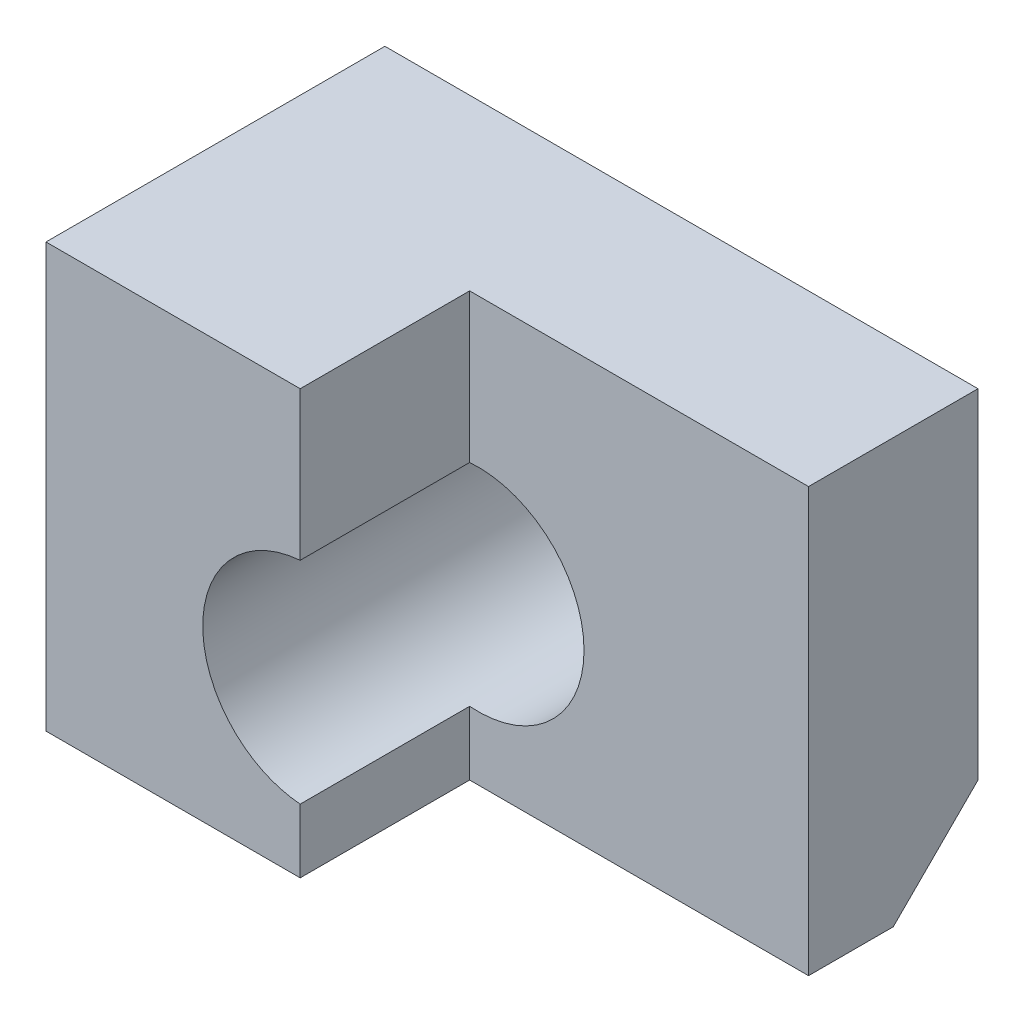
ISO-10303-21;
HEADER;
FILE_DESCRIPTION(('STEP AP214'),'2;1');
FILE_NAME('part.step','',(''),(''),'','','');
FILE_SCHEMA(('AUTOMOTIVE_DESIGN { 1 0 10303 214 1 1 1 1 }'));
ENDSEC;
DATA;
#1=APPLICATION_CONTEXT('core data for automotive mechanical design processes');
#2=APPLICATION_PROTOCOL_DEFINITION('international standard','automotive_design',2000,#1);
#3=PRODUCT_CONTEXT('',#1,'mechanical');
#4=PRODUCT('Part','Part','',(#3));
#5=PRODUCT_RELATED_PRODUCT_CATEGORY('part','',(#4));
#6=PRODUCT_DEFINITION_FORMATION('','',#4);
#7=PRODUCT_DEFINITION_CONTEXT('part definition',#1,'design');
#8=PRODUCT_DEFINITION('design','',#6,#7);
#9=PRODUCT_DEFINITION_SHAPE('','',#8);
#10=(LENGTH_UNIT() NAMED_UNIT(*) SI_UNIT(.MILLI.,.METRE.));
#11=(NAMED_UNIT(*) PLANE_ANGLE_UNIT() SI_UNIT($,.RADIAN.));
#12=(NAMED_UNIT(*) SI_UNIT($,.STERADIAN.) SOLID_ANGLE_UNIT());
#13=UNCERTAINTY_MEASURE_WITH_UNIT(LENGTH_MEASURE(1.E-05),#10,'distance_accuracy_value','');
#14=(GEOMETRIC_REPRESENTATION_CONTEXT(3) GLOBAL_UNCERTAINTY_ASSIGNED_CONTEXT((#13)) GLOBAL_UNIT_ASSIGNED_CONTEXT((#10,
#11,#12)) REPRESENTATION_CONTEXT('',''));
#15=CARTESIAN_POINT('',(0.,0.,0.));
#16=DIRECTION('',(0.,0.,1.));
#17=DIRECTION('',(1.,0.,0.));
#18=AXIS2_PLACEMENT_3D('',#15,#16,#17);
#19=CARTESIAN_POINT('',(7.,0.,4.));
#20=DIRECTION('',(-1.,0.,0.));
#21=DIRECTION('',(0.,0.,1.));
#22=AXIS2_PLACEMENT_3D('',#19,#20,#21);
#23=PLANE('',#22);
#24=DIRECTION('',(0.,0.,-1.));
#25=VECTOR('',#24,1.);
#26=CARTESIAN_POINT('',(7.,0.,4.));
#27=LINE('',#26,#25);
#28=CARTESIAN_POINT('',(7.,0.,2.));
#29=VERTEX_POINT('',#28);
#30=CARTESIAN_POINT('',(7.,0.,1.00000000000002));
#31=VERTEX_POINT('',#30);
#32=EDGE_CURVE('E139',#29,#31,#27,.T.);
#33=ORIENTED_EDGE('',*,*,#32,.T.);
#34=DIRECTION('',(0.,0.707106781186544,-0.707106781186551));
#35=VECTOR('',#34,1.);
#36=CARTESIAN_POINT('',(7.,0.,1.00000000000002));
#37=LINE('',#36,#35);
#38=CARTESIAN_POINT('',(7.,1.00000000000001,0.));
#39=VERTEX_POINT('',#38);
#40=EDGE_CURVE('E162',#31,#39,#37,.T.);
#41=ORIENTED_EDGE('',*,*,#40,.T.);
#42=DIRECTION('',(0.,1.,0.));
#43=VECTOR('',#42,1.);
#44=CARTESIAN_POINT('',(7.,0.,0.));
#45=LINE('',#44,#43);
#46=CARTESIAN_POINT('',(7.,5.,0.));
#47=VERTEX_POINT('',#46);
#48=EDGE_CURVE('E138',#39,#47,#45,.T.);
#49=ORIENTED_EDGE('',*,*,#48,.T.);
#50=DIRECTION('',(0.,0.,-1.));
#51=VECTOR('',#50,1.);
#52=CARTESIAN_POINT('',(7.,5.,4.));
#53=LINE('',#52,#51);
#54=CARTESIAN_POINT('',(7.,5.,2.));
#55=VERTEX_POINT('',#54);
#56=EDGE_CURVE('E132',#55,#47,#53,.T.);
#57=ORIENTED_EDGE('',*,*,#56,.F.);
#58=DIRECTION('',(0.,1.,0.));
#59=VECTOR('',#58,1.);
#60=CARTESIAN_POINT('',(7.,0.,2.));
#61=LINE('',#60,#59);
#62=EDGE_CURVE('E115',#29,#55,#61,.T.);
#63=ORIENTED_EDGE('',*,*,#62,.F.);
#64=EDGE_LOOP('',(#33,#41,#49,#57,#63));
#65=FACE_BOUND('',#64,.T.);
#66=ADVANCED_FACE('F38',(#65),#23,.F.);
#67=CARTESIAN_POINT('',(0.,0.,4.));
#68=DIRECTION('',(1.,0.,0.));
#69=DIRECTION('',(0.,0.,-1.));
#70=AXIS2_PLACEMENT_3D('',#67,#68,#69);
#71=PLANE('',#70);
#72=DIRECTION('',(0.,-1.,0.));
#73=VECTOR('',#72,1.);
#74=CARTESIAN_POINT('',(0.,0.,0.));
#75=LINE('',#74,#73);
#76=CARTESIAN_POINT('',(0.,5.,0.));
#77=VERTEX_POINT('',#76);
#78=CARTESIAN_POINT('',(0.,1.00000000000001,0.));
#79=VERTEX_POINT('',#78);
#80=EDGE_CURVE('E181',#77,#79,#75,.T.);
#81=ORIENTED_EDGE('',*,*,#80,.T.);
#82=DIRECTION('',(0.,-0.707106781186544,0.707106781186551));
#83=VECTOR('',#82,1.);
#84=CARTESIAN_POINT('',(0.,0.,1.00000000000002));
#85=LINE('',#84,#83);
#86=CARTESIAN_POINT('',(0.,0.,1.00000000000002));
#87=VERTEX_POINT('',#86);
#88=EDGE_CURVE('E11',#79,#87,#85,.T.);
#89=ORIENTED_EDGE('',*,*,#88,.T.);
#90=DIRECTION('',(0.,0.,-1.));
#91=VECTOR('',#90,1.);
#92=CARTESIAN_POINT('',(0.,0.,4.));
#93=LINE('',#92,#91);
#94=CARTESIAN_POINT('',(0.,0.,4.));
#95=VERTEX_POINT('',#94);
#96=EDGE_CURVE('E142',#95,#87,#93,.T.);
#97=ORIENTED_EDGE('',*,*,#96,.F.);
#98=DIRECTION('',(0.,-1.,0.));
#99=VECTOR('',#98,1.);
#100=CARTESIAN_POINT('',(0.,0.,4.));
#101=LINE('',#100,#99);
#102=CARTESIAN_POINT('',(0.,5.,4.));
#103=VERTEX_POINT('',#102);
#104=EDGE_CURVE('E191',#103,#95,#101,.T.);
#105=ORIENTED_EDGE('',*,*,#104,.F.);
#106=DIRECTION('',(0.,0.,-1.));
#107=VECTOR('',#106,1.);
#108=CARTESIAN_POINT('',(0.,5.,4.));
#109=LINE('',#108,#107);
#110=EDGE_CURVE('E140',#103,#77,#109,.T.);
#111=ORIENTED_EDGE('',*,*,#110,.T.);
#112=EDGE_LOOP('',(#81,#89,#97,#105,#111));
#113=FACE_BOUND('',#112,.T.);
#114=ADVANCED_FACE('F179',(#113),#71,.F.);
#115=CARTESIAN_POINT('',(0.,0.,4.));
#116=DIRECTION('',(0.,1.,0.));
#117=DIRECTION('',(0.,0.,1.));
#118=AXIS2_PLACEMENT_3D('',#115,#116,#117);
#119=PLANE('',#118);
#120=ORIENTED_EDGE('',*,*,#96,.T.);
#121=DIRECTION('',(1.,0.,0.));
#122=VECTOR('',#121,1.);
#123=CARTESIAN_POINT('',(7.,0.,1.00000000000002));
#124=LINE('',#123,#122);
#125=EDGE_CURVE('E159',#87,#31,#124,.T.);
#126=ORIENTED_EDGE('',*,*,#125,.T.);
#127=ORIENTED_EDGE('',*,*,#32,.F.);
#128=DIRECTION('',(1.,0.,0.));
#129=VECTOR('',#128,1.);
#130=CARTESIAN_POINT('',(7.,0.,2.));
#131=LINE('',#130,#129);
#132=CARTESIAN_POINT('',(3.,0.,2.));
#133=VERTEX_POINT('',#132);
#134=EDGE_CURVE('E121',#133,#29,#131,.T.);
#135=ORIENTED_EDGE('',*,*,#134,.F.);
#136=DIRECTION('',(0.,0.,1.));
#137=VECTOR('',#136,1.);
#138=CARTESIAN_POINT('',(3.,0.,2.));
#139=LINE('',#138,#137);
#140=CARTESIAN_POINT('',(3.,0.,4.));
#141=VERTEX_POINT('',#140);
#142=EDGE_CURVE('E173',#133,#141,#139,.T.);
#143=ORIENTED_EDGE('',*,*,#142,.T.);
#144=DIRECTION('',(1.,0.,0.));
#145=VECTOR('',#144,1.);
#146=CARTESIAN_POINT('',(0.,0.,4.));
#147=LINE('',#146,#145);
#148=EDGE_CURVE('E186',#95,#141,#147,.T.);
#149=ORIENTED_EDGE('',*,*,#148,.F.);
#150=EDGE_LOOP('',(#120,#126,#127,#135,#143,#149));
#151=FACE_BOUND('',#150,.T.);
#152=ADVANCED_FACE('F183',(#151),#119,.F.);
#153=CARTESIAN_POINT('',(0.,5.,4.));
#154=DIRECTION('',(0.,-1.,0.));
#155=DIRECTION('',(0.,0.,-1.));
#156=AXIS2_PLACEMENT_3D('',#153,#154,#155);
#157=PLANE('',#156);
#158=DIRECTION('',(-1.,0.,0.));
#159=VECTOR('',#158,1.);
#160=CARTESIAN_POINT('',(0.,5.,4.));
#161=LINE('',#160,#159);
#162=CARTESIAN_POINT('',(3.,5.,4.));
#163=VERTEX_POINT('',#162);
#164=EDGE_CURVE('E145',#163,#103,#161,.T.);
#165=ORIENTED_EDGE('',*,*,#164,.F.);
#166=DIRECTION('',(0.,0.,1.));
#167=VECTOR('',#166,1.);
#168=CARTESIAN_POINT('',(3.,5.,2.));
#169=LINE('',#168,#167);
#170=CARTESIAN_POINT('',(3.,5.,2.));
#171=VERTEX_POINT('',#170);
#172=EDGE_CURVE('E134',#171,#163,#169,.T.);
#173=ORIENTED_EDGE('',*,*,#172,.F.);
#174=DIRECTION('',(-1.,0.,0.));
#175=VECTOR('',#174,1.);
#176=CARTESIAN_POINT('',(7.,5.,2.));
#177=LINE('',#176,#175);
#178=EDGE_CURVE('E118',#55,#171,#177,.T.);
#179=ORIENTED_EDGE('',*,*,#178,.F.);
#180=ORIENTED_EDGE('',*,*,#56,.T.);
#181=DIRECTION('',(-1.,0.,0.));
#182=VECTOR('',#181,1.);
#183=CARTESIAN_POINT('',(0.,5.,0.));
#184=LINE('',#183,#182);
#185=EDGE_CURVE('E196',#47,#77,#184,.T.);
#186=ORIENTED_EDGE('',*,*,#185,.T.);
#187=ORIENTED_EDGE('',*,*,#110,.F.);
#188=EDGE_LOOP('',(#165,#173,#179,#180,#186,#187));
#189=FACE_BOUND('',#188,.T.);
#190=ADVANCED_FACE('F131',(#189),#157,.F.);
#191=CARTESIAN_POINT('',(0.,0.,4.));
#192=DIRECTION('',(0.,0.,-1.));
#193=DIRECTION('',(-1.,0.,0.));
#194=AXIS2_PLACEMENT_3D('',#191,#192,#193);
#195=PLANE('',#194);
#196=ORIENTED_EDGE('',*,*,#148,.T.);
#197=DIRECTION('',(0.,-1.,0.));
#198=VECTOR('',#197,1.);
#199=CARTESIAN_POINT('',(3.,0.,4.));
#200=LINE('',#199,#198);
#201=CARTESIAN_POINT('',(3.,0.754006420562291,4.));
#202=VERTEX_POINT('',#201);
#203=EDGE_CURVE('E204',#202,#141,#200,.T.);
#204=ORIENTED_EDGE('',*,*,#203,.F.);
#205=CARTESIAN_POINT('',(3.1,2.,4.));
#206=DIRECTION('',(0.,0.,-1.));
#207=DIRECTION('',(-1.,0.,0.));
#208=AXIS2_PLACEMENT_3D('',#205,#206,#207);
#209=CIRCLE('',#208,1.25);
#210=CARTESIAN_POINT('',(3.,3.24599357943771,4.));
#211=VERTEX_POINT('',#210);
#212=EDGE_CURVE('E172',#202,#211,#209,.T.);
#213=ORIENTED_EDGE('',*,*,#212,.T.);
#214=EDGE_CURVE('E126',#163,#211,#200,.T.);
#215=ORIENTED_EDGE('',*,*,#214,.F.);
#216=ORIENTED_EDGE('',*,*,#164,.T.);
#217=ORIENTED_EDGE('',*,*,#104,.T.);
#218=EDGE_LOOP('',(#196,#204,#213,#215,#216,#217));
#219=FACE_BOUND('',#218,.T.);
#220=ADVANCED_FACE('F193',(#219),#195,.F.);
#221=CARTESIAN_POINT('',(0.,0.,0.));
#222=DIRECTION('',(0.,0.,-1.));
#223=DIRECTION('',(-1.,0.,0.));
#224=AXIS2_PLACEMENT_3D('',#221,#222,#223);
#225=PLANE('',#224);
#226=ORIENTED_EDGE('',*,*,#48,.F.);
#227=DIRECTION('',(-1.,0.,0.));
#228=VECTOR('',#227,1.);
#229=CARTESIAN_POINT('',(0.,1.00000000000001,0.));
#230=LINE('',#229,#228);
#231=CARTESIAN_POINT('',(3.85000000000001,1.00000000000001,0.));
#232=VERTEX_POINT('',#231);
#233=EDGE_CURVE('E165',#39,#232,#230,.T.);
#234=ORIENTED_EDGE('',*,*,#233,.T.);
#235=CARTESIAN_POINT('',(3.1,2.,0.));
#236=DIRECTION('',(0.,0.,-1.));
#237=DIRECTION('',(-1.,0.,0.));
#238=AXIS2_PLACEMENT_3D('',#235,#236,#237);
#239=CIRCLE('',#238,1.25);
#240=CARTESIAN_POINT('',(2.34999999999999,1.00000000000001,0.));
#241=VERTEX_POINT('',#240);
#242=EDGE_CURVE('E168',#241,#232,#239,.T.);
#243=ORIENTED_EDGE('',*,*,#242,.F.);
#244=DIRECTION('',(-1.,0.,0.));
#245=VECTOR('',#244,1.);
#246=CARTESIAN_POINT('',(0.,1.00000000000001,0.));
#247=LINE('',#246,#245);
#248=EDGE_CURVE('E53',#241,#79,#247,.T.);
#249=ORIENTED_EDGE('',*,*,#248,.T.);
#250=ORIENTED_EDGE('',*,*,#80,.F.);
#251=ORIENTED_EDGE('',*,*,#185,.F.);
#252=EDGE_LOOP('',(#226,#234,#243,#249,#250,#251));
#253=FACE_BOUND('',#252,.T.);
#254=ADVANCED_FACE('F167',(#253),#225,.T.);
#255=CARTESIAN_POINT('',(3.1,2.,0.));
#256=DIRECTION('',(0.,0.,-1.));
#257=DIRECTION('',(-1.,0.,0.));
#258=AXIS2_PLACEMENT_3D('',#255,#256,#257);
#259=CYLINDRICAL_SURFACE('',#258,1.25);
#260=ORIENTED_EDGE('',*,*,#242,.T.);
#261=CARTESIAN_POINT('',(3.1,2.,-1.));
#262=DIRECTION('',(0.,-0.707106781186551,-0.707106781186544));
#263=DIRECTION('',(0.,0.707106781186544,-0.707106781186551));
#264=AXIS2_PLACEMENT_3D('',#261,#262,#263);
#265=ELLIPSE('',#264,1.76776695296638,1.25);
#266=EDGE_CURVE('E46',#232,#241,#265,.T.);
#267=ORIENTED_EDGE('',*,*,#266,.T.);
#268=EDGE_LOOP('',(#260,#267));
#269=FACE_BOUND('',#268,.T.);
#270=CARTESIAN_POINT('',(3.1,2.,2.));
#271=DIRECTION('',(0.,0.,1.));
#272=DIRECTION('',(1.,0.,0.));
#273=AXIS2_PLACEMENT_3D('',#270,#271,#272);
#274=CIRCLE('',#273,1.25);
#275=CARTESIAN_POINT('',(3.,3.24599357943771,2.));
#276=VERTEX_POINT('',#275);
#277=CARTESIAN_POINT('',(3.,0.754006420562291,2.));
#278=VERTEX_POINT('',#277);
#279=EDGE_CURVE('E151',#276,#278,#274,.F.);
#280=ORIENTED_EDGE('',*,*,#279,.F.);
#281=DIRECTION('',(0.,0.,-1.));
#282=VECTOR('',#281,1.);
#283=CARTESIAN_POINT('',(3.,3.24599357943771,0.));
#284=LINE('',#283,#282);
#285=EDGE_CURVE('E156',#276,#211,#284,.F.);
#286=ORIENTED_EDGE('',*,*,#285,.T.);
#287=ORIENTED_EDGE('',*,*,#212,.F.);
#288=DIRECTION('',(0.,0.,-1.));
#289=VECTOR('',#288,1.);
#290=CARTESIAN_POINT('',(3.,0.754006420562291,0.));
#291=LINE('',#290,#289);
#292=EDGE_CURVE('E153',#202,#278,#291,.T.);
#293=ORIENTED_EDGE('',*,*,#292,.T.);
#294=EDGE_LOOP('',(#280,#286,#287,#293));
#295=FACE_BOUND('',#294,.T.);
#296=ADVANCED_FACE('F170',(#269,#295),#259,.F.);
#297=CARTESIAN_POINT('',(3.,0.,2.));
#298=DIRECTION('',(-1.,0.,0.));
#299=DIRECTION('',(0.,0.,1.));
#300=AXIS2_PLACEMENT_3D('',#297,#298,#299);
#301=PLANE('',#300);
#302=DIRECTION('',(0.,-1.,0.));
#303=VECTOR('',#302,1.);
#304=CARTESIAN_POINT('',(3.,0.,2.));
#305=LINE('',#304,#303);
#306=EDGE_CURVE('E209',#171,#276,#305,.T.);
#307=ORIENTED_EDGE('',*,*,#306,.F.);
#308=ORIENTED_EDGE('',*,*,#172,.T.);
#309=ORIENTED_EDGE('',*,*,#214,.T.);
#310=ORIENTED_EDGE('',*,*,#285,.F.);
#311=EDGE_LOOP('',(#307,#308,#309,#310));
#312=FACE_BOUND('',#311,.T.);
#313=ADVANCED_FACE('F208',(#312),#301,.F.);
#314=ORIENTED_EDGE('',*,*,#203,.T.);
#315=ORIENTED_EDGE('',*,*,#142,.F.);
#316=EDGE_CURVE('E135',#278,#133,#305,.T.);
#317=ORIENTED_EDGE('',*,*,#316,.F.);
#318=ORIENTED_EDGE('',*,*,#292,.F.);
#319=EDGE_LOOP('',(#314,#315,#317,#318));
#320=FACE_BOUND('',#319,.T.);
#321=ADVANCED_FACE('F217',(#320),#301,.F.);
#322=CARTESIAN_POINT('',(0.,0.,2.));
#323=DIRECTION('',(0.,0.,1.));
#324=DIRECTION('',(1.,0.,0.));
#325=AXIS2_PLACEMENT_3D('',#322,#323,#324);
#326=PLANE('',#325);
#327=ORIENTED_EDGE('',*,*,#279,.T.);
#328=ORIENTED_EDGE('',*,*,#316,.T.);
#329=ORIENTED_EDGE('',*,*,#134,.T.);
#330=ORIENTED_EDGE('',*,*,#62,.T.);
#331=ORIENTED_EDGE('',*,*,#178,.T.);
#332=ORIENTED_EDGE('',*,*,#306,.T.);
#333=EDGE_LOOP('',(#327,#328,#329,#330,#331,#332));
#334=FACE_BOUND('',#333,.T.);
#335=ADVANCED_FACE('F117',(#334),#326,.T.);
#336=CARTESIAN_POINT('',(0.,0.,1.00000000000002));
#337=DIRECTION('',(0.,-0.707106781186551,-0.707106781186544));
#338=DIRECTION('',(-1.,0.,0.));
#339=AXIS2_PLACEMENT_3D('',#336,#337,#338);
#340=PLANE('',#339);
#341=ORIENTED_EDGE('',*,*,#266,.F.);
#342=ORIENTED_EDGE('',*,*,#233,.F.);
#343=ORIENTED_EDGE('',*,*,#40,.F.);
#344=ORIENTED_EDGE('',*,*,#125,.F.);
#345=ORIENTED_EDGE('',*,*,#88,.F.);
#346=ORIENTED_EDGE('',*,*,#248,.F.);
#347=EDGE_LOOP('',(#341,#342,#343,#344,#345,#346));
#348=FACE_BOUND('',#347,.T.);
#349=ADVANCED_FACE('F40',(#348),#340,.T.);
#350=CLOSED_SHELL('',(#66,#114,#152,#190,#220,#254,#296,#313,#321,#335,#349));
#351=MANIFOLD_SOLID_BREP('B2',#350);
#352=ADVANCED_BREP_SHAPE_REPRESENTATION('',(#18,#351),#14);
#353=SHAPE_DEFINITION_REPRESENTATION(#9,#352);
ENDSEC;
END-ISO-10303-21;
